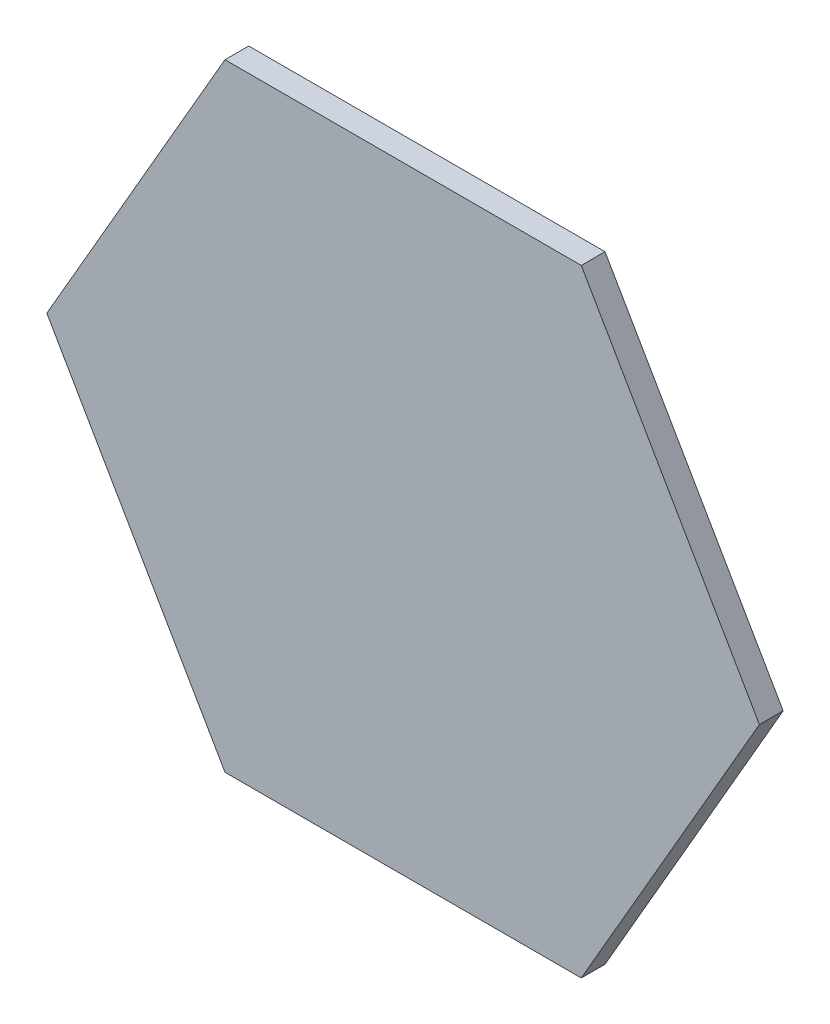
ISO-10303-21;
HEADER;
FILE_DESCRIPTION(('STEP AP214'),'2;1');
FILE_NAME('part.step','',(''),(''),'','','');
FILE_SCHEMA(('AUTOMOTIVE_DESIGN { 1 0 10303 214 1 1 1 1 }'));
ENDSEC;
DATA;
#1=APPLICATION_CONTEXT('core data for automotive mechanical design processes');
#2=APPLICATION_PROTOCOL_DEFINITION('international standard','automotive_design',2000,#1);
#3=PRODUCT_CONTEXT('',#1,'mechanical');
#4=PRODUCT('Part','Part','',(#3));
#5=PRODUCT_RELATED_PRODUCT_CATEGORY('part','',(#4));
#6=PRODUCT_DEFINITION_FORMATION('','',#4);
#7=PRODUCT_DEFINITION_CONTEXT('part definition',#1,'design');
#8=PRODUCT_DEFINITION('design','',#6,#7);
#9=PRODUCT_DEFINITION_SHAPE('','',#8);
#10=(LENGTH_UNIT() NAMED_UNIT(*) SI_UNIT(.MILLI.,.METRE.));
#11=(NAMED_UNIT(*) PLANE_ANGLE_UNIT() SI_UNIT($,.RADIAN.));
#12=(NAMED_UNIT(*) SI_UNIT($,.STERADIAN.) SOLID_ANGLE_UNIT());
#13=UNCERTAINTY_MEASURE_WITH_UNIT(LENGTH_MEASURE(1.E-05),#10,'distance_accuracy_value','');
#14=(GEOMETRIC_REPRESENTATION_CONTEXT(3) GLOBAL_UNCERTAINTY_ASSIGNED_CONTEXT((#13)) GLOBAL_UNIT_ASSIGNED_CONTEXT((#10,
#11,#12)) REPRESENTATION_CONTEXT('',''));
#15=CARTESIAN_POINT('',(0.,0.,0.));
#16=DIRECTION('',(0.,0.,1.));
#17=DIRECTION('',(1.,0.,0.));
#18=AXIS2_PLACEMENT_3D('',#15,#16,#17);
#19=CARTESIAN_POINT('',(150.,0.,10.));
#20=DIRECTION('',(-0.866025403784438,-0.5,0.));
#21=DIRECTION('',(0.5,-0.866025403784438,0.));
#22=AXIS2_PLACEMENT_3D('',#19,#20,#21);
#23=PLANE('',#22);
#24=DIRECTION('',(-0.5,0.866025403784439,0.));
#25=VECTOR('',#24,1.);
#26=CARTESIAN_POINT('',(150.,0.,0.));
#27=LINE('',#26,#25);
#28=CARTESIAN_POINT('',(150.,0.,0.));
#29=VERTEX_POINT('',#28);
#30=CARTESIAN_POINT('',(75.,129.903810567666,0.));
#31=VERTEX_POINT('',#30);
#32=EDGE_CURVE('E128',#29,#31,#27,.T.);
#33=ORIENTED_EDGE('',*,*,#32,.T.);
#34=DIRECTION('',(0.,0.,-1.));
#35=VECTOR('',#34,1.);
#36=CARTESIAN_POINT('',(75.,129.903810567666,10.));
#37=LINE('',#36,#35);
#38=CARTESIAN_POINT('',(75.,129.903810567666,10.));
#39=VERTEX_POINT('',#38);
#40=EDGE_CURVE('E11',#39,#31,#37,.T.);
#41=ORIENTED_EDGE('',*,*,#40,.F.);
#42=DIRECTION('',(-0.5,0.866025403784439,0.));
#43=VECTOR('',#42,1.);
#44=CARTESIAN_POINT('',(150.,0.,10.));
#45=LINE('',#44,#43);
#46=CARTESIAN_POINT('',(150.,0.,10.));
#47=VERTEX_POINT('',#46);
#48=EDGE_CURVE('E144',#47,#39,#45,.T.);
#49=ORIENTED_EDGE('',*,*,#48,.F.);
#50=DIRECTION('',(0.,0.,-1.));
#51=VECTOR('',#50,1.);
#52=CARTESIAN_POINT('',(150.,0.,10.));
#53=LINE('',#52,#51);
#54=EDGE_CURVE('E124',#47,#29,#53,.T.);
#55=ORIENTED_EDGE('',*,*,#54,.T.);
#56=EDGE_LOOP('',(#33,#41,#49,#55));
#57=FACE_BOUND('',#56,.T.);
#58=ADVANCED_FACE('F39',(#57),#23,.F.);
#59=CARTESIAN_POINT('',(75.,129.903810567666,10.));
#60=DIRECTION('',(0.,-1.,0.));
#61=DIRECTION('',(0.,0.,-1.));
#62=AXIS2_PLACEMENT_3D('',#59,#60,#61);
#63=PLANE('',#62);
#64=DIRECTION('',(-1.,0.,0.));
#65=VECTOR('',#64,1.);
#66=CARTESIAN_POINT('',(75.,129.903810567666,0.));
#67=LINE('',#66,#65);
#68=CARTESIAN_POINT('',(-75.,129.903810567666,0.));
#69=VERTEX_POINT('',#68);
#70=EDGE_CURVE('E132',#31,#69,#67,.T.);
#71=ORIENTED_EDGE('',*,*,#70,.T.);
#72=DIRECTION('',(0.,0.,-1.));
#73=VECTOR('',#72,1.);
#74=CARTESIAN_POINT('',(-75.,129.903810567666,10.));
#75=LINE('',#74,#73);
#76=CARTESIAN_POINT('',(-75.,129.903810567666,10.));
#77=VERTEX_POINT('',#76);
#78=EDGE_CURVE('E48',#77,#69,#75,.T.);
#79=ORIENTED_EDGE('',*,*,#78,.F.);
#80=DIRECTION('',(-1.,0.,0.));
#81=VECTOR('',#80,1.);
#82=CARTESIAN_POINT('',(75.,129.903810567666,10.));
#83=LINE('',#82,#81);
#84=EDGE_CURVE('E93',#39,#77,#83,.T.);
#85=ORIENTED_EDGE('',*,*,#84,.F.);
#86=ORIENTED_EDGE('',*,*,#40,.T.);
#87=EDGE_LOOP('',(#71,#79,#85,#86));
#88=FACE_BOUND('',#87,.T.);
#89=ADVANCED_FACE('F172',(#88),#63,.F.);
#90=CARTESIAN_POINT('',(-75.,129.903810567666,10.));
#91=DIRECTION('',(0.866025403784439,-0.5,0.));
#92=DIRECTION('',(0.5,0.866025403784439,0.));
#93=AXIS2_PLACEMENT_3D('',#90,#91,#92);
#94=PLANE('',#93);
#95=DIRECTION('',(-0.5,-0.866025403784439,0.));
#96=VECTOR('',#95,1.);
#97=CARTESIAN_POINT('',(-75.,129.903810567666,0.));
#98=LINE('',#97,#96);
#99=CARTESIAN_POINT('',(-150.,0.,0.));
#100=VERTEX_POINT('',#99);
#101=EDGE_CURVE('E135',#69,#100,#98,.T.);
#102=ORIENTED_EDGE('',*,*,#101,.T.);
#103=DIRECTION('',(0.,0.,-1.));
#104=VECTOR('',#103,1.);
#105=CARTESIAN_POINT('',(-150.,0.,10.));
#106=LINE('',#105,#104);
#107=CARTESIAN_POINT('',(-150.,0.,10.));
#108=VERTEX_POINT('',#107);
#109=EDGE_CURVE('E117',#108,#100,#106,.T.);
#110=ORIENTED_EDGE('',*,*,#109,.F.);
#111=DIRECTION('',(-0.5,-0.866025403784439,0.));
#112=VECTOR('',#111,1.);
#113=CARTESIAN_POINT('',(-75.,129.903810567666,10.));
#114=LINE('',#113,#112);
#115=EDGE_CURVE('E106',#77,#108,#114,.T.);
#116=ORIENTED_EDGE('',*,*,#115,.F.);
#117=ORIENTED_EDGE('',*,*,#78,.T.);
#118=EDGE_LOOP('',(#102,#110,#116,#117));
#119=FACE_BOUND('',#118,.T.);
#120=ADVANCED_FACE('F154',(#119),#94,.F.);
#121=CARTESIAN_POINT('',(-150.,0.,10.));
#122=DIRECTION('',(0.866025403784438,0.5,0.));
#123=DIRECTION('',(-0.5,0.866025403784439,0.));
#124=AXIS2_PLACEMENT_3D('',#121,#122,#123);
#125=PLANE('',#124);
#126=DIRECTION('',(0.5,-0.866025403784438,0.));
#127=VECTOR('',#126,1.);
#128=CARTESIAN_POINT('',(-150.,0.,0.));
#129=LINE('',#128,#127);
#130=CARTESIAN_POINT('',(-74.9999999999999,-129.903810567666,0.));
#131=VERTEX_POINT('',#130);
#132=EDGE_CURVE('E115',#100,#131,#129,.T.);
#133=ORIENTED_EDGE('',*,*,#132,.T.);
#134=DIRECTION('',(0.,0.,-1.));
#135=VECTOR('',#134,1.);
#136=CARTESIAN_POINT('',(-74.9999999999999,-129.903810567666,10.));
#137=LINE('',#136,#135);
#138=CARTESIAN_POINT('',(-74.9999999999999,-129.903810567666,10.));
#139=VERTEX_POINT('',#138);
#140=EDGE_CURVE('E112',#139,#131,#137,.T.);
#141=ORIENTED_EDGE('',*,*,#140,.F.);
#142=DIRECTION('',(0.5,-0.866025403784438,0.));
#143=VECTOR('',#142,1.);
#144=CARTESIAN_POINT('',(-150.,0.,10.));
#145=LINE('',#144,#143);
#146=EDGE_CURVE('E100',#108,#139,#145,.T.);
#147=ORIENTED_EDGE('',*,*,#146,.F.);
#148=ORIENTED_EDGE('',*,*,#109,.T.);
#149=EDGE_LOOP('',(#133,#141,#147,#148));
#150=FACE_BOUND('',#149,.T.);
#151=ADVANCED_FACE('F113',(#150),#125,.F.);
#152=CARTESIAN_POINT('',(-74.9999999999999,-129.903810567666,10.));
#153=DIRECTION('',(0.,1.,0.));
#154=DIRECTION('',(-1.,0.,0.));
#155=AXIS2_PLACEMENT_3D('',#152,#153,#154);
#156=PLANE('',#155);
#157=DIRECTION('',(1.,0.,0.));
#158=VECTOR('',#157,1.);
#159=CARTESIAN_POINT('',(-74.9999999999999,-129.903810567666,0.));
#160=LINE('',#159,#158);
#161=CARTESIAN_POINT('',(75.0000000000001,-129.903810567666,0.));
#162=VERTEX_POINT('',#161);
#163=EDGE_CURVE('E79',#131,#162,#160,.T.);
#164=ORIENTED_EDGE('',*,*,#163,.T.);
#165=DIRECTION('',(0.,0.,-1.));
#166=VECTOR('',#165,1.);
#167=CARTESIAN_POINT('',(75.0000000000001,-129.903810567666,10.));
#168=LINE('',#167,#166);
#169=CARTESIAN_POINT('',(75.0000000000001,-129.903810567666,10.));
#170=VERTEX_POINT('',#169);
#171=EDGE_CURVE('E118',#170,#162,#168,.T.);
#172=ORIENTED_EDGE('',*,*,#171,.F.);
#173=DIRECTION('',(1.,0.,0.));
#174=VECTOR('',#173,1.);
#175=CARTESIAN_POINT('',(-74.9999999999999,-129.903810567666,10.));
#176=LINE('',#175,#174);
#177=EDGE_CURVE('E104',#139,#170,#176,.T.);
#178=ORIENTED_EDGE('',*,*,#177,.F.);
#179=ORIENTED_EDGE('',*,*,#140,.T.);
#180=EDGE_LOOP('',(#164,#172,#178,#179));
#181=FACE_BOUND('',#180,.T.);
#182=ADVANCED_FACE('F120',(#181),#156,.F.);
#183=CARTESIAN_POINT('',(75.0000000000001,-129.903810567666,10.));
#184=DIRECTION('',(-0.866025403784439,0.5,0.));
#185=DIRECTION('',(-0.5,-0.866025403784439,0.));
#186=AXIS2_PLACEMENT_3D('',#183,#184,#185);
#187=PLANE('',#186);
#188=DIRECTION('',(0.5,0.866025403784439,0.));
#189=VECTOR('',#188,1.);
#190=CARTESIAN_POINT('',(75.0000000000001,-129.903810567666,0.));
#191=LINE('',#190,#189);
#192=EDGE_CURVE('E85',#162,#29,#191,.T.);
#193=ORIENTED_EDGE('',*,*,#192,.T.);
#194=ORIENTED_EDGE('',*,*,#54,.F.);
#195=DIRECTION('',(0.5,0.866025403784439,0.));
#196=VECTOR('',#195,1.);
#197=CARTESIAN_POINT('',(75.0000000000001,-129.903810567666,10.));
#198=LINE('',#197,#196);
#199=EDGE_CURVE('E56',#170,#47,#198,.T.);
#200=ORIENTED_EDGE('',*,*,#199,.F.);
#201=ORIENTED_EDGE('',*,*,#171,.T.);
#202=EDGE_LOOP('',(#193,#194,#200,#201));
#203=FACE_BOUND('',#202,.T.);
#204=ADVANCED_FACE('F161',(#203),#187,.F.);
#205=CARTESIAN_POINT('',(0.,0.,10.));
#206=DIRECTION('',(0.,0.,1.));
#207=DIRECTION('',(1.,0.,0.));
#208=AXIS2_PLACEMENT_3D('',#205,#206,#207);
#209=PLANE('',#208);
#210=ORIENTED_EDGE('',*,*,#48,.T.);
#211=ORIENTED_EDGE('',*,*,#84,.T.);
#212=ORIENTED_EDGE('',*,*,#115,.T.);
#213=ORIENTED_EDGE('',*,*,#146,.T.);
#214=ORIENTED_EDGE('',*,*,#177,.T.);
#215=ORIENTED_EDGE('',*,*,#199,.T.);
#216=EDGE_LOOP('',(#210,#211,#212,#213,#214,#215));
#217=FACE_BOUND('',#216,.T.);
#218=ADVANCED_FACE('F102',(#217),#209,.T.);
#219=CARTESIAN_POINT('',(0.,0.,0.));
#220=DIRECTION('',(0.,0.,1.));
#221=DIRECTION('',(1.,0.,0.));
#222=AXIS2_PLACEMENT_3D('',#219,#220,#221);
#223=PLANE('',#222);
#224=ORIENTED_EDGE('',*,*,#32,.F.);
#225=ORIENTED_EDGE('',*,*,#192,.F.);
#226=ORIENTED_EDGE('',*,*,#163,.F.);
#227=ORIENTED_EDGE('',*,*,#132,.F.);
#228=ORIENTED_EDGE('',*,*,#101,.F.);
#229=ORIENTED_EDGE('',*,*,#70,.F.);
#230=EDGE_LOOP('',(#224,#225,#226,#227,#228,#229));
#231=FACE_BOUND('',#230,.T.);
#232=ADVANCED_FACE('F157',(#231),#223,.F.);
#233=CLOSED_SHELL('',(#58,#89,#120,#151,#182,#204,#218,#232));
#234=MANIFOLD_SOLID_BREP('B2',#233);
#235=ADVANCED_BREP_SHAPE_REPRESENTATION('',(#18,#234),#14);
#236=SHAPE_DEFINITION_REPRESENTATION(#9,#235);
ENDSEC;
END-ISO-10303-21;
